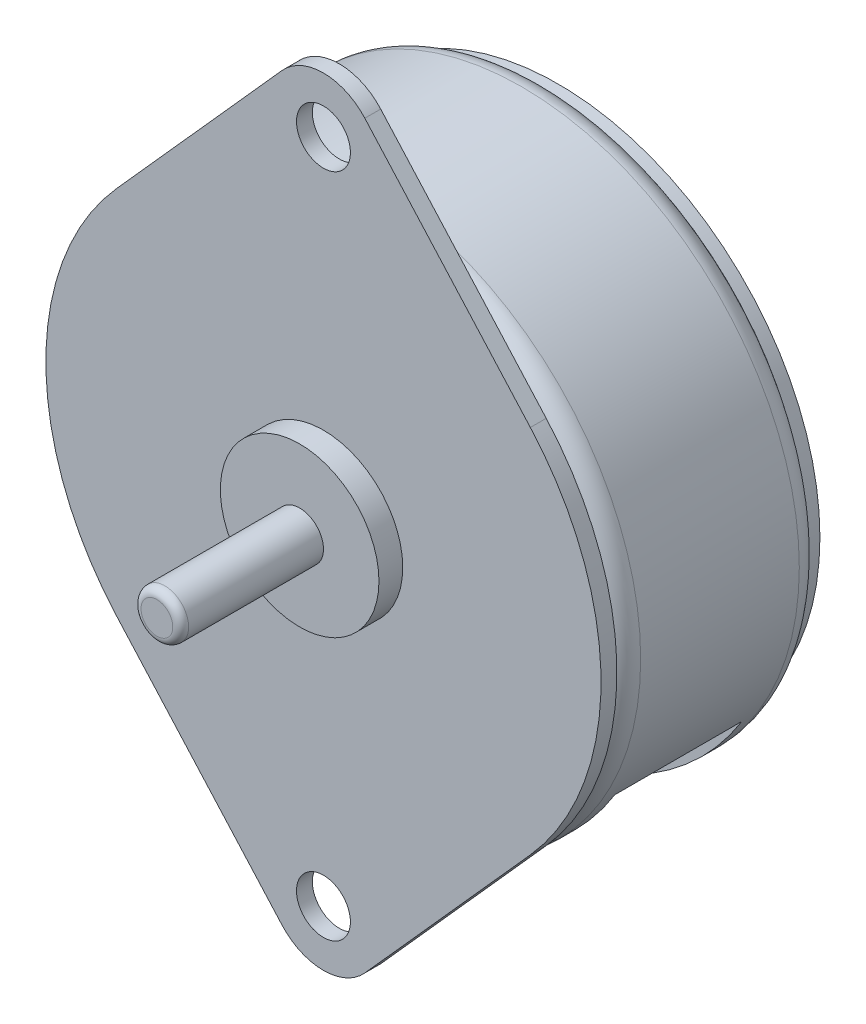
ISO-10303-21;
HEADER;
FILE_DESCRIPTION(('STEP AP214'),'2;1');
FILE_NAME('part.step','',(''),(''),'','','');
FILE_SCHEMA(('AUTOMOTIVE_DESIGN { 1 0 10303 214 1 1 1 1 }'));
ENDSEC;
DATA;
#1=APPLICATION_CONTEXT('core data for automotive mechanical design processes');
#2=APPLICATION_PROTOCOL_DEFINITION('international standard','automotive_design',2000,#1);
#3=PRODUCT_CONTEXT('',#1,'mechanical');
#4=PRODUCT('Part','Part','',(#3));
#5=PRODUCT_RELATED_PRODUCT_CATEGORY('part','',(#4));
#6=PRODUCT_DEFINITION_FORMATION('','',#4);
#7=PRODUCT_DEFINITION_CONTEXT('part definition',#1,'design');
#8=PRODUCT_DEFINITION('design','',#6,#7);
#9=PRODUCT_DEFINITION_SHAPE('','',#8);
#10=(LENGTH_UNIT() NAMED_UNIT(*) SI_UNIT(.MILLI.,.METRE.));
#11=(NAMED_UNIT(*) PLANE_ANGLE_UNIT() SI_UNIT($,.RADIAN.));
#12=(NAMED_UNIT(*) SI_UNIT($,.STERADIAN.) SOLID_ANGLE_UNIT());
#13=UNCERTAINTY_MEASURE_WITH_UNIT(LENGTH_MEASURE(1.E-05),#10,'distance_accuracy_value','');
#14=(GEOMETRIC_REPRESENTATION_CONTEXT(3) GLOBAL_UNCERTAINTY_ASSIGNED_CONTEXT((#13)) GLOBAL_UNIT_ASSIGNED_CONTEXT((#10,
#11,#12)) REPRESENTATION_CONTEXT('',''));
#15=CARTESIAN_POINT('',(0.,0.,0.));
#16=DIRECTION('',(0.,0.,1.));
#17=DIRECTION('',(1.,0.,0.));
#18=AXIS2_PLACEMENT_3D('',#15,#16,#17);
#19=CARTESIAN_POINT('',(0.,0.,-13.));
#20=DIRECTION('',(0.,0.,1.));
#21=DIRECTION('',(1.,0.,0.));
#22=AXIS2_PLACEMENT_3D('',#19,#20,#21);
#23=CYLINDRICAL_SURFACE('',#22,17.5);
#24=CARTESIAN_POINT('',(0.,0.,-1.5));
#25=DIRECTION('',(0.,0.,-1.));
#26=DIRECTION('',(-1.,0.,0.));
#27=AXIS2_PLACEMENT_3D('',#24,#25,#26);
#28=CIRCLE('',#27,17.5);
#29=CARTESIAN_POINT('',(-17.5,0.,-1.5));
#30=VERTEX_POINT('',#29);
#31=EDGE_CURVE('E192',#30,#30,#28,.T.);
#32=ORIENTED_EDGE('',*,*,#31,.T.);
#33=EDGE_LOOP('',(#32));
#34=FACE_BOUND('',#33,.T.);
#35=CARTESIAN_POINT('',(0.,0.,-11.5));
#36=DIRECTION('',(0.,0.,-1.));
#37=DIRECTION('',(-1.,0.,0.));
#38=AXIS2_PLACEMENT_3D('',#35,#36,#37);
#39=CIRCLE('',#38,17.5);
#40=CARTESIAN_POINT('',(-17.5,0.,-11.5));
#41=VERTEX_POINT('',#40);
#42=EDGE_CURVE('E195',#41,#41,#39,.F.);
#43=ORIENTED_EDGE('',*,*,#42,.T.);
#44=EDGE_LOOP('',(#43));
#45=FACE_BOUND('',#44,.T.);
#46=DIRECTION('',(0.,0.,1.));
#47=VECTOR('',#46,1.);
#48=CARTESIAN_POINT('',(9.21835667841054,-14.875210927903,-13.));
#49=LINE('',#48,#47);
#50=CARTESIAN_POINT('',(9.21835667841054,-14.875210927903,-2.5));
#51=VERTEX_POINT('',#50);
#52=CARTESIAN_POINT('',(9.21835667841054,-14.875210927903,-10.5));
#53=VERTEX_POINT('',#52);
#54=EDGE_CURVE('E11',#51,#53,#49,.F.);
#55=ORIENTED_EDGE('',*,*,#54,.F.);
#56=CARTESIAN_POINT('',(0.,0.,-2.5));
#57=DIRECTION('',(0.,0.,-1.));
#58=DIRECTION('',(-1.,0.,0.));
#59=AXIS2_PLACEMENT_3D('',#56,#57,#58);
#60=CIRCLE('',#59,17.5);
#61=CARTESIAN_POINT('',(14.8752109279029,-9.21835667841059,-2.5));
#62=VERTEX_POINT('',#61);
#63=EDGE_CURVE('E55',#62,#51,#60,.T.);
#64=ORIENTED_EDGE('',*,*,#63,.F.);
#65=DIRECTION('',(0.,0.,1.));
#66=VECTOR('',#65,1.);
#67=CARTESIAN_POINT('',(14.8752109279029,-9.21835667841059,-13.));
#68=LINE('',#67,#66);
#69=CARTESIAN_POINT('',(14.8752109279029,-9.21835667841059,-10.5));
#70=VERTEX_POINT('',#69);
#71=EDGE_CURVE('E283',#70,#62,#68,.T.);
#72=ORIENTED_EDGE('',*,*,#71,.F.);
#73=CARTESIAN_POINT('',(0.,0.,-10.5));
#74=DIRECTION('',(0.,0.,1.));
#75=DIRECTION('',(1.,0.,0.));
#76=AXIS2_PLACEMENT_3D('',#73,#74,#75);
#77=CIRCLE('',#76,17.5);
#78=EDGE_CURVE('E48',#53,#70,#77,.T.);
#79=ORIENTED_EDGE('',*,*,#78,.F.);
#80=EDGE_LOOP('',(#55,#64,#72,#79));
#81=FACE_BOUND('',#80,.T.);
#82=ADVANCED_FACE('F40',(#34,#45,#81),#23,.T.);
#83=CARTESIAN_POINT('',(0.,0.,-14.3));
#84=DIRECTION('',(0.,0.,-1.));
#85=DIRECTION('',(-1.,0.,0.));
#86=AXIS2_PLACEMENT_3D('',#83,#84,#85);
#87=PLANE('',#86);
#88=CARTESIAN_POINT('',(0.,0.,-14.3));
#89=DIRECTION('',(0.,0.,-1.));
#90=DIRECTION('',(-1.,0.,0.));
#91=AXIS2_PLACEMENT_3D('',#88,#89,#90);
#92=CIRCLE('',#91,3.);
#93=CARTESIAN_POINT('',(-3.,0.,-14.3));
#94=VERTEX_POINT('',#93);
#95=EDGE_CURVE('E169',#94,#94,#92,.T.);
#96=ORIENTED_EDGE('',*,*,#95,.T.);
#97=EDGE_LOOP('',(#96));
#98=FACE_BOUND('',#97,.T.);
#99=CARTESIAN_POINT('',(0.,0.,-14.3));
#100=DIRECTION('',(0.,0.,-1.));
#101=DIRECTION('',(-1.,0.,0.));
#102=AXIS2_PLACEMENT_3D('',#99,#100,#101);
#103=CIRCLE('',#102,1.5);
#104=CARTESIAN_POINT('',(-1.5,0.,-14.3));
#105=VERTEX_POINT('',#104);
#106=EDGE_CURVE('E163',#105,#105,#103,.T.);
#107=ORIENTED_EDGE('',*,*,#106,.F.);
#108=EDGE_LOOP('',(#107));
#109=FACE_BOUND('',#108,.T.);
#110=ADVANCED_FACE('F290',(#98,#109),#87,.T.);
#111=CARTESIAN_POINT('',(0.,0.,-13.8));
#112=DIRECTION('',(0.,0.,-1.));
#113=DIRECTION('',(-1.,0.,0.));
#114=AXIS2_PLACEMENT_3D('',#111,#112,#113);
#115=PLANE('',#114);
#116=CARTESIAN_POINT('',(0.,0.,-13.8));
#117=DIRECTION('',(0.,0.,-1.));
#118=DIRECTION('',(-1.,0.,0.));
#119=AXIS2_PLACEMENT_3D('',#116,#117,#118);
#120=CIRCLE('',#119,16.5);
#121=CARTESIAN_POINT('',(-16.5,0.,-13.8));
#122=VERTEX_POINT('',#121);
#123=EDGE_CURVE('E184',#122,#122,#120,.T.);
#124=ORIENTED_EDGE('',*,*,#123,.T.);
#125=EDGE_LOOP('',(#124));
#126=FACE_BOUND('',#125,.T.);
#127=CARTESIAN_POINT('',(0.,0.,-13.8));
#128=DIRECTION('',(0.,0.,-1.));
#129=DIRECTION('',(-1.,0.,0.));
#130=AXIS2_PLACEMENT_3D('',#127,#128,#129);
#131=CIRCLE('',#130,3.);
#132=CARTESIAN_POINT('',(-3.,0.,-13.8));
#133=VERTEX_POINT('',#132);
#134=EDGE_CURVE('E168',#133,#133,#131,.T.);
#135=ORIENTED_EDGE('',*,*,#134,.F.);
#136=EDGE_LOOP('',(#135));
#137=FACE_BOUND('',#136,.T.);
#138=ADVANCED_FACE('F296',(#126,#137),#115,.T.);
#139=CARTESIAN_POINT('',(0.,0.,2.5));
#140=DIRECTION('',(0.,0.,1.));
#141=DIRECTION('',(1.,0.,0.));
#142=AXIS2_PLACEMENT_3D('',#139,#140,#141);
#143=PLANE('',#142);
#144=CARTESIAN_POINT('',(0.,0.,2.5));
#145=DIRECTION('',(0.,0.,1.));
#146=DIRECTION('',(1.,0.,0.));
#147=AXIS2_PLACEMENT_3D('',#144,#145,#146);
#148=CIRCLE('',#147,5.);
#149=CARTESIAN_POINT('',(5.,0.,2.5));
#150=VERTEX_POINT('',#149);
#151=EDGE_CURVE('E178',#150,#150,#148,.T.);
#152=ORIENTED_EDGE('',*,*,#151,.T.);
#153=EDGE_LOOP('',(#152));
#154=FACE_BOUND('',#153,.T.);
#155=CARTESIAN_POINT('',(0.,0.,2.5));
#156=DIRECTION('',(0.,0.,1.));
#157=DIRECTION('',(1.,0.,0.));
#158=AXIS2_PLACEMENT_3D('',#155,#156,#157);
#159=CIRCLE('',#158,1.5);
#160=CARTESIAN_POINT('',(1.5,0.,2.5));
#161=VERTEX_POINT('',#160);
#162=EDGE_CURVE('E172',#161,#161,#159,.T.);
#163=ORIENTED_EDGE('',*,*,#162,.F.);
#164=EDGE_LOOP('',(#163));
#165=FACE_BOUND('',#164,.T.);
#166=ADVANCED_FACE('F325',(#154,#165),#143,.T.);
#167=CARTESIAN_POINT('',(0.,0.,1.));
#168=DIRECTION('',(0.,0.,1.));
#169=DIRECTION('',(1.,0.,0.));
#170=AXIS2_PLACEMENT_3D('',#167,#168,#169);
#171=PLANE('',#170);
#172=CARTESIAN_POINT('',(0.,-21.,1.));
#173=DIRECTION('',(0.,0.,1.));
#174=DIRECTION('',(1.,0.,0.));
#175=AXIS2_PLACEMENT_3D('',#172,#173,#174);
#176=CIRCLE('',#175,1.7);
#177=CARTESIAN_POINT('',(1.7,-21.,1.));
#178=VERTEX_POINT('',#177);
#179=EDGE_CURVE('E199',#178,#178,#176,.T.);
#180=ORIENTED_EDGE('',*,*,#179,.F.);
#181=EDGE_LOOP('',(#180));
#182=FACE_BOUND('',#181,.T.);
#183=CARTESIAN_POINT('',(0.,0.,1.));
#184=DIRECTION('',(0.,0.,1.));
#185=DIRECTION('',(1.,0.,0.));
#186=AXIS2_PLACEMENT_3D('',#183,#184,#185);
#187=CIRCLE('',#186,17.5);
#188=CARTESIAN_POINT('',(-13.0437298687488,11.6666666666667,1.));
#189=VERTEX_POINT('',#188);
#190=CARTESIAN_POINT('',(-13.0437298687488,-11.6666666666667,1.));
#191=VERTEX_POINT('',#190);
#192=EDGE_CURVE('E211',#189,#191,#187,.T.);
#193=ORIENTED_EDGE('',*,*,#192,.T.);
#194=DIRECTION('',(0.666666666666667,-0.74535599249993,0.));
#195=VECTOR('',#194,1.);
#196=CARTESIAN_POINT('',(-13.0437298687488,-11.6666666666667,1.));
#197=LINE('',#196,#195);
#198=CARTESIAN_POINT('',(-2.60874597374975,-23.3333333333333,1.));
#199=VERTEX_POINT('',#198);
#200=EDGE_CURVE('E214',#191,#199,#197,.T.);
#201=ORIENTED_EDGE('',*,*,#200,.T.);
#202=CARTESIAN_POINT('',(0.,-21.,1.));
#203=DIRECTION('',(0.,0.,1.));
#204=DIRECTION('',(-1.,0.,0.));
#205=AXIS2_PLACEMENT_3D('',#202,#203,#204);
#206=CIRCLE('',#205,3.5);
#207=CARTESIAN_POINT('',(2.60874597374975,-23.3333333333333,1.));
#208=VERTEX_POINT('',#207);
#209=EDGE_CURVE('E217',#199,#208,#206,.T.);
#210=ORIENTED_EDGE('',*,*,#209,.T.);
#211=DIRECTION('',(0.666666666666667,0.74535599249993,0.));
#212=VECTOR('',#211,1.);
#213=CARTESIAN_POINT('',(2.60874597374975,-23.3333333333333,1.));
#214=LINE('',#213,#212);
#215=CARTESIAN_POINT('',(13.0437298687488,-11.6666666666667,1.));
#216=VERTEX_POINT('',#215);
#217=EDGE_CURVE('E219',#208,#216,#214,.T.);
#218=ORIENTED_EDGE('',*,*,#217,.T.);
#219=CARTESIAN_POINT('',(0.,0.,1.));
#220=DIRECTION('',(0.,0.,1.));
#221=DIRECTION('',(1.,0.,0.));
#222=AXIS2_PLACEMENT_3D('',#219,#220,#221);
#223=CIRCLE('',#222,17.5);
#224=CARTESIAN_POINT('',(13.0437298687488,11.6666666666667,1.));
#225=VERTEX_POINT('',#224);
#226=EDGE_CURVE('E221',#216,#225,#223,.T.);
#227=ORIENTED_EDGE('',*,*,#226,.T.);
#228=DIRECTION('',(-0.666666666666667,0.74535599249993,0.));
#229=VECTOR('',#228,1.);
#230=CARTESIAN_POINT('',(2.60874597374975,23.3333333333333,1.));
#231=LINE('',#230,#229);
#232=CARTESIAN_POINT('',(2.60874597374975,23.3333333333333,1.));
#233=VERTEX_POINT('',#232);
#234=EDGE_CURVE('E223',#225,#233,#231,.T.);
#235=ORIENTED_EDGE('',*,*,#234,.T.);
#236=CARTESIAN_POINT('',(0.,21.,1.));
#237=DIRECTION('',(0.,0.,1.));
#238=DIRECTION('',(-1.,0.,0.));
#239=AXIS2_PLACEMENT_3D('',#236,#237,#238);
#240=CIRCLE('',#239,3.5);
#241=CARTESIAN_POINT('',(-2.60874597374975,23.3333333333333,1.));
#242=VERTEX_POINT('',#241);
#243=EDGE_CURVE('E225',#233,#242,#240,.T.);
#244=ORIENTED_EDGE('',*,*,#243,.T.);
#245=DIRECTION('',(-0.666666666666667,-0.74535599249993,0.));
#246=VECTOR('',#245,1.);
#247=CARTESIAN_POINT('',(-13.0437298687488,11.6666666666667,1.));
#248=LINE('',#247,#246);
#249=EDGE_CURVE('E227',#242,#189,#248,.T.);
#250=ORIENTED_EDGE('',*,*,#249,.T.);
#251=EDGE_LOOP('',(#193,#201,#210,#218,#227,#235,#244,#250));
#252=FACE_BOUND('',#251,.T.);
#253=CARTESIAN_POINT('',(0.,21.,1.));
#254=DIRECTION('',(0.,0.,1.));
#255=DIRECTION('',(1.,0.,0.));
#256=AXIS2_PLACEMENT_3D('',#253,#254,#255);
#257=CIRCLE('',#256,1.7);
#258=CARTESIAN_POINT('',(1.7,21.,1.));
#259=VERTEX_POINT('',#258);
#260=EDGE_CURVE('E205',#259,#259,#257,.T.);
#261=ORIENTED_EDGE('',*,*,#260,.F.);
#262=EDGE_LOOP('',(#261));
#263=FACE_BOUND('',#262,.T.);
#264=CARTESIAN_POINT('',(0.,0.,1.));
#265=DIRECTION('',(0.,0.,1.));
#266=DIRECTION('',(1.,0.,0.));
#267=AXIS2_PLACEMENT_3D('',#264,#265,#266);
#268=CIRCLE('',#267,5.);
#269=CARTESIAN_POINT('',(5.,0.,1.));
#270=VERTEX_POINT('',#269);
#271=EDGE_CURVE('E177',#270,#270,#268,.T.);
#272=ORIENTED_EDGE('',*,*,#271,.F.);
#273=EDGE_LOOP('',(#272));
#274=FACE_BOUND('',#273,.T.);
#275=ADVANCED_FACE('F321',(#182,#252,#263,#274),#171,.T.);
#276=CARTESIAN_POINT('',(0.,0.,0.));
#277=DIRECTION('',(0.,0.,1.));
#278=DIRECTION('',(1.,0.,0.));
#279=AXIS2_PLACEMENT_3D('',#276,#277,#278);
#280=PLANE('',#279);
#281=CARTESIAN_POINT('',(0.,-21.,0.));
#282=DIRECTION('',(0.,0.,1.));
#283=DIRECTION('',(1.,0.,0.));
#284=AXIS2_PLACEMENT_3D('',#281,#282,#283);
#285=CIRCLE('',#284,1.7);
#286=CARTESIAN_POINT('',(1.7,-21.,0.));
#287=VERTEX_POINT('',#286);
#288=EDGE_CURVE('E198',#287,#287,#285,.T.);
#289=ORIENTED_EDGE('',*,*,#288,.T.);
#290=EDGE_LOOP('',(#289));
#291=FACE_BOUND('',#290,.T.);
#292=CARTESIAN_POINT('',(0.,0.,0.));
#293=DIRECTION('',(0.,0.,1.));
#294=DIRECTION('',(1.,0.,0.));
#295=AXIS2_PLACEMENT_3D('',#292,#293,#294);
#296=CIRCLE('',#295,17.5);
#297=CARTESIAN_POINT('',(-13.0437298687488,11.6666666666667,0.));
#298=VERTEX_POINT('',#297);
#299=CARTESIAN_POINT('',(-13.0437298687488,-11.6666666666667,0.));
#300=VERTEX_POINT('',#299);
#301=EDGE_CURVE('E208',#298,#300,#296,.T.);
#302=ORIENTED_EDGE('',*,*,#301,.F.);
#303=DIRECTION('',(-0.666666666666667,-0.74535599249993,0.));
#304=VECTOR('',#303,1.);
#305=CARTESIAN_POINT('',(-13.0437298687488,11.6666666666667,0.));
#306=LINE('',#305,#304);
#307=CARTESIAN_POINT('',(-2.60874597374975,23.3333333333333,0.));
#308=VERTEX_POINT('',#307);
#309=EDGE_CURVE('E215',#308,#298,#306,.T.);
#310=ORIENTED_EDGE('',*,*,#309,.F.);
#311=CARTESIAN_POINT('',(0.,21.,0.));
#312=DIRECTION('',(0.,0.,1.));
#313=DIRECTION('',(-1.,0.,0.));
#314=AXIS2_PLACEMENT_3D('',#311,#312,#313);
#315=CIRCLE('',#314,3.5);
#316=CARTESIAN_POINT('',(2.60874597374975,23.3333333333333,0.));
#317=VERTEX_POINT('',#316);
#318=EDGE_CURVE('E242',#317,#308,#315,.T.);
#319=ORIENTED_EDGE('',*,*,#318,.F.);
#320=DIRECTION('',(-0.666666666666667,0.74535599249993,0.));
#321=VECTOR('',#320,1.);
#322=CARTESIAN_POINT('',(2.60874597374975,23.3333333333333,0.));
#323=LINE('',#322,#321);
#324=CARTESIAN_POINT('',(13.0437298687488,11.6666666666667,0.));
#325=VERTEX_POINT('',#324);
#326=EDGE_CURVE('E240',#325,#317,#323,.T.);
#327=ORIENTED_EDGE('',*,*,#326,.F.);
#328=CARTESIAN_POINT('',(0.,0.,0.));
#329=DIRECTION('',(0.,0.,1.));
#330=DIRECTION('',(1.,0.,0.));
#331=AXIS2_PLACEMENT_3D('',#328,#329,#330);
#332=CIRCLE('',#331,17.5);
#333=CARTESIAN_POINT('',(13.0437298687488,-11.6666666666667,0.));
#334=VERTEX_POINT('',#333);
#335=EDGE_CURVE('E238',#334,#325,#332,.T.);
#336=ORIENTED_EDGE('',*,*,#335,.F.);
#337=DIRECTION('',(0.666666666666667,0.74535599249993,0.));
#338=VECTOR('',#337,1.);
#339=CARTESIAN_POINT('',(2.60874597374975,-23.3333333333333,0.));
#340=LINE('',#339,#338);
#341=CARTESIAN_POINT('',(2.60874597374975,-23.3333333333333,0.));
#342=VERTEX_POINT('',#341);
#343=EDGE_CURVE('E236',#342,#334,#340,.T.);
#344=ORIENTED_EDGE('',*,*,#343,.F.);
#345=CARTESIAN_POINT('',(0.,-21.,0.));
#346=DIRECTION('',(0.,0.,1.));
#347=DIRECTION('',(-1.,0.,0.));
#348=AXIS2_PLACEMENT_3D('',#345,#346,#347);
#349=CIRCLE('',#348,3.5);
#350=CARTESIAN_POINT('',(-2.60874597374975,-23.3333333333333,0.));
#351=VERTEX_POINT('',#350);
#352=EDGE_CURVE('E234',#351,#342,#349,.T.);
#353=ORIENTED_EDGE('',*,*,#352,.F.);
#354=DIRECTION('',(0.666666666666667,-0.74535599249993,0.));
#355=VECTOR('',#354,1.);
#356=CARTESIAN_POINT('',(-13.0437298687488,-11.6666666666667,0.));
#357=LINE('',#356,#355);
#358=EDGE_CURVE('E232',#300,#351,#357,.T.);
#359=ORIENTED_EDGE('',*,*,#358,.F.);
#360=EDGE_LOOP('',(#302,#310,#319,#327,#336,#344,#353,#359));
#361=FACE_BOUND('',#360,.T.);
#362=CARTESIAN_POINT('',(0.,21.,0.));
#363=DIRECTION('',(0.,0.,1.));
#364=DIRECTION('',(1.,0.,0.));
#365=AXIS2_PLACEMENT_3D('',#362,#363,#364);
#366=CIRCLE('',#365,1.7);
#367=CARTESIAN_POINT('',(1.7,21.,0.));
#368=VERTEX_POINT('',#367);
#369=EDGE_CURVE('E202',#368,#368,#366,.T.);
#370=ORIENTED_EDGE('',*,*,#369,.T.);
#371=EDGE_LOOP('',(#370));
#372=FACE_BOUND('',#371,.T.);
#373=CARTESIAN_POINT('',(0.,0.,0.));
#374=DIRECTION('',(0.,0.,-1.));
#375=DIRECTION('',(-1.,0.,0.));
#376=AXIS2_PLACEMENT_3D('',#373,#374,#375);
#377=CIRCLE('',#376,16.);
#378=CARTESIAN_POINT('',(-16.,0.,0.));
#379=VERTEX_POINT('',#378);
#380=EDGE_CURVE('E268',#379,#379,#377,.T.);
#381=ORIENTED_EDGE('',*,*,#380,.F.);
#382=EDGE_LOOP('',(#381));
#383=FACE_BOUND('',#382,.T.);
#384=ADVANCED_FACE('F324',(#291,#361,#372,#383),#280,.F.);
#385=CARTESIAN_POINT('',(0.,0.,1.));
#386=DIRECTION('',(0.,0.,-1.));
#387=DIRECTION('',(-1.,0.,0.));
#388=AXIS2_PLACEMENT_3D('',#385,#386,#387);
#389=CYLINDRICAL_SURFACE('',#388,17.5);
#390=ORIENTED_EDGE('',*,*,#301,.T.);
#391=DIRECTION('',(0.,0.,-1.));
#392=VECTOR('',#391,1.);
#393=CARTESIAN_POINT('',(-13.0437298687488,-11.6666666666667,1.));
#394=LINE('',#393,#392);
#395=EDGE_CURVE('E265',#191,#300,#394,.T.);
#396=ORIENTED_EDGE('',*,*,#395,.F.);
#397=ORIENTED_EDGE('',*,*,#192,.F.);
#398=DIRECTION('',(0.,0.,-1.));
#399=VECTOR('',#398,1.);
#400=CARTESIAN_POINT('',(-13.0437298687488,11.6666666666667,1.));
#401=LINE('',#400,#399);
#402=EDGE_CURVE('E229',#189,#298,#401,.T.);
#403=ORIENTED_EDGE('',*,*,#402,.T.);
#404=EDGE_LOOP('',(#390,#396,#397,#403));
#405=FACE_BOUND('',#404,.T.);
#406=ADVANCED_FACE('F329',(#405),#389,.T.);
#407=CARTESIAN_POINT('',(-13.0437298687488,-11.6666666666667,1.));
#408=DIRECTION('',(0.74535599249993,0.666666666666667,0.));
#409=DIRECTION('',(-0.666666666666667,0.74535599249993,0.));
#410=AXIS2_PLACEMENT_3D('',#407,#408,#409);
#411=PLANE('',#410);
#412=ORIENTED_EDGE('',*,*,#358,.T.);
#413=DIRECTION('',(0.,0.,-1.));
#414=VECTOR('',#413,1.);
#415=CARTESIAN_POINT('',(-2.60874597374975,-23.3333333333333,1.));
#416=LINE('',#415,#414);
#417=EDGE_CURVE('E262',#199,#351,#416,.T.);
#418=ORIENTED_EDGE('',*,*,#417,.F.);
#419=ORIENTED_EDGE('',*,*,#200,.F.);
#420=ORIENTED_EDGE('',*,*,#395,.T.);
#421=EDGE_LOOP('',(#412,#418,#419,#420));
#422=FACE_BOUND('',#421,.T.);
#423=ADVANCED_FACE('F353',(#422),#411,.F.);
#424=CARTESIAN_POINT('',(0.,-21.,1.));
#425=DIRECTION('',(0.,0.,-1.));
#426=DIRECTION('',(-1.,0.,0.));
#427=AXIS2_PLACEMENT_3D('',#424,#425,#426);
#428=CYLINDRICAL_SURFACE('',#427,3.5);
#429=ORIENTED_EDGE('',*,*,#352,.T.);
#430=DIRECTION('',(0.,0.,-1.));
#431=VECTOR('',#430,1.);
#432=CARTESIAN_POINT('',(2.60874597374975,-23.3333333333333,1.));
#433=LINE('',#432,#431);
#434=EDGE_CURVE('E259',#208,#342,#433,.T.);
#435=ORIENTED_EDGE('',*,*,#434,.F.);
#436=ORIENTED_EDGE('',*,*,#209,.F.);
#437=ORIENTED_EDGE('',*,*,#417,.T.);
#438=EDGE_LOOP('',(#429,#435,#436,#437));
#439=FACE_BOUND('',#438,.T.);
#440=ADVANCED_FACE('F349',(#439),#428,.T.);
#441=CARTESIAN_POINT('',(2.60874597374975,-23.3333333333333,1.));
#442=DIRECTION('',(-0.74535599249993,0.666666666666667,0.));
#443=DIRECTION('',(-0.666666666666667,-0.74535599249993,0.));
#444=AXIS2_PLACEMENT_3D('',#441,#442,#443);
#445=PLANE('',#444);
#446=ORIENTED_EDGE('',*,*,#343,.T.);
#447=DIRECTION('',(0.,0.,-1.));
#448=VECTOR('',#447,1.);
#449=CARTESIAN_POINT('',(13.0437298687488,-11.6666666666667,1.));
#450=LINE('',#449,#448);
#451=EDGE_CURVE('E256',#216,#334,#450,.T.);
#452=ORIENTED_EDGE('',*,*,#451,.F.);
#453=ORIENTED_EDGE('',*,*,#217,.F.);
#454=ORIENTED_EDGE('',*,*,#434,.T.);
#455=EDGE_LOOP('',(#446,#452,#453,#454));
#456=FACE_BOUND('',#455,.T.);
#457=ADVANCED_FACE('F345',(#456),#445,.F.);
#458=CARTESIAN_POINT('',(0.,0.,1.));
#459=DIRECTION('',(0.,0.,-1.));
#460=DIRECTION('',(-1.,0.,0.));
#461=AXIS2_PLACEMENT_3D('',#458,#459,#460);
#462=CYLINDRICAL_SURFACE('',#461,17.5);
#463=ORIENTED_EDGE('',*,*,#335,.T.);
#464=DIRECTION('',(0.,0.,-1.));
#465=VECTOR('',#464,1.);
#466=CARTESIAN_POINT('',(13.0437298687488,11.6666666666667,1.));
#467=LINE('',#466,#465);
#468=EDGE_CURVE('E253',#225,#325,#467,.T.);
#469=ORIENTED_EDGE('',*,*,#468,.F.);
#470=ORIENTED_EDGE('',*,*,#226,.F.);
#471=ORIENTED_EDGE('',*,*,#451,.T.);
#472=EDGE_LOOP('',(#463,#469,#470,#471));
#473=FACE_BOUND('',#472,.T.);
#474=ADVANCED_FACE('F341',(#473),#462,.T.);
#475=CARTESIAN_POINT('',(2.60874597374975,23.3333333333333,1.));
#476=DIRECTION('',(-0.74535599249993,-0.666666666666667,0.));
#477=DIRECTION('',(0.666666666666667,-0.74535599249993,0.));
#478=AXIS2_PLACEMENT_3D('',#475,#476,#477);
#479=PLANE('',#478);
#480=ORIENTED_EDGE('',*,*,#326,.T.);
#481=DIRECTION('',(0.,0.,-1.));
#482=VECTOR('',#481,1.);
#483=CARTESIAN_POINT('',(2.60874597374975,23.3333333333333,1.));
#484=LINE('',#483,#482);
#485=EDGE_CURVE('E250',#233,#317,#484,.T.);
#486=ORIENTED_EDGE('',*,*,#485,.F.);
#487=ORIENTED_EDGE('',*,*,#234,.F.);
#488=ORIENTED_EDGE('',*,*,#468,.T.);
#489=EDGE_LOOP('',(#480,#486,#487,#488));
#490=FACE_BOUND('',#489,.T.);
#491=ADVANCED_FACE('F337',(#490),#479,.F.);
#492=CARTESIAN_POINT('',(0.,21.,1.));
#493=DIRECTION('',(0.,0.,-1.));
#494=DIRECTION('',(-1.,0.,0.));
#495=AXIS2_PLACEMENT_3D('',#492,#493,#494);
#496=CYLINDRICAL_SURFACE('',#495,3.5);
#497=ORIENTED_EDGE('',*,*,#318,.T.);
#498=DIRECTION('',(0.,0.,-1.));
#499=VECTOR('',#498,1.);
#500=CARTESIAN_POINT('',(-2.60874597374975,23.3333333333333,1.));
#501=LINE('',#500,#499);
#502=EDGE_CURVE('E247',#242,#308,#501,.T.);
#503=ORIENTED_EDGE('',*,*,#502,.F.);
#504=ORIENTED_EDGE('',*,*,#243,.F.);
#505=ORIENTED_EDGE('',*,*,#485,.T.);
#506=EDGE_LOOP('',(#497,#503,#504,#505));
#507=FACE_BOUND('',#506,.T.);
#508=ADVANCED_FACE('F333',(#507),#496,.T.);
#509=CARTESIAN_POINT('',(-13.0437298687488,11.6666666666667,1.));
#510=DIRECTION('',(0.74535599249993,-0.666666666666667,0.));
#511=DIRECTION('',(0.666666666666667,0.74535599249993,0.));
#512=AXIS2_PLACEMENT_3D('',#509,#510,#511);
#513=PLANE('',#512);
#514=ORIENTED_EDGE('',*,*,#309,.T.);
#515=ORIENTED_EDGE('',*,*,#402,.F.);
#516=ORIENTED_EDGE('',*,*,#249,.F.);
#517=ORIENTED_EDGE('',*,*,#502,.T.);
#518=EDGE_LOOP('',(#514,#515,#516,#517));
#519=FACE_BOUND('',#518,.T.);
#520=ADVANCED_FACE('F319',(#519),#513,.F.);
#521=CARTESIAN_POINT('',(0.,21.,1.));
#522=DIRECTION('',(0.,0.,-1.));
#523=DIRECTION('',(-1.,0.,0.));
#524=AXIS2_PLACEMENT_3D('',#521,#522,#523);
#525=CYLINDRICAL_SURFACE('',#524,1.7);
#526=ORIENTED_EDGE('',*,*,#260,.T.);
#527=EDGE_LOOP('',(#526));
#528=FACE_BOUND('',#527,.T.);
#529=ORIENTED_EDGE('',*,*,#369,.F.);
#530=EDGE_LOOP('',(#529));
#531=FACE_BOUND('',#530,.T.);
#532=ADVANCED_FACE('F315',(#528,#531),#525,.F.);
#533=CARTESIAN_POINT('',(0.,-21.,1.));
#534=DIRECTION('',(0.,0.,-1.));
#535=DIRECTION('',(-1.,0.,0.));
#536=AXIS2_PLACEMENT_3D('',#533,#534,#535);
#537=CYLINDRICAL_SURFACE('',#536,1.7);
#538=ORIENTED_EDGE('',*,*,#179,.T.);
#539=EDGE_LOOP('',(#538));
#540=FACE_BOUND('',#539,.T.);
#541=ORIENTED_EDGE('',*,*,#288,.F.);
#542=EDGE_LOOP('',(#541));
#543=FACE_BOUND('',#542,.T.);
#544=ADVANCED_FACE('F308',(#540,#543),#537,.F.);
#545=CARTESIAN_POINT('',(0.,0.,-11.5));
#546=DIRECTION('',(0.,0.,-1.));
#547=DIRECTION('',(-1.,0.,0.));
#548=AXIS2_PLACEMENT_3D('',#545,#546,#547);
#549=TOROIDAL_SURFACE('',#548,16.,1.5);
#550=ORIENTED_EDGE('',*,*,#42,.F.);
#551=EDGE_LOOP('',(#550));
#552=FACE_BOUND('',#551,.T.);
#553=CARTESIAN_POINT('',(0.,0.,-13.));
#554=DIRECTION('',(0.,0.,-1.));
#555=DIRECTION('',(-1.,0.,0.));
#556=AXIS2_PLACEMENT_3D('',#553,#554,#555);
#557=CIRCLE('',#556,16.);
#558=CARTESIAN_POINT('',(-16.,0.,-13.));
#559=VERTEX_POINT('',#558);
#560=EDGE_CURVE('E187',#559,#559,#557,.T.);
#561=ORIENTED_EDGE('',*,*,#560,.F.);
#562=EDGE_LOOP('',(#561));
#563=FACE_BOUND('',#562,.T.);
#564=ADVANCED_FACE('F304',(#552,#563),#549,.T.);
#565=CARTESIAN_POINT('',(0.,0.,-1.5));
#566=DIRECTION('',(0.,0.,-1.));
#567=DIRECTION('',(-1.,0.,0.));
#568=AXIS2_PLACEMENT_3D('',#565,#566,#567);
#569=TOROIDAL_SURFACE('',#568,16.,1.5);
#570=ORIENTED_EDGE('',*,*,#380,.T.);
#571=EDGE_LOOP('',(#570));
#572=FACE_BOUND('',#571,.T.);
#573=ORIENTED_EDGE('',*,*,#31,.F.);
#574=EDGE_LOOP('',(#573));
#575=FACE_BOUND('',#574,.T.);
#576=ADVANCED_FACE('F307',(#572,#575),#569,.T.);
#577=CARTESIAN_POINT('',(0.,0.,-13.8));
#578=DIRECTION('',(0.,0.,1.));
#579=DIRECTION('',(1.,0.,0.));
#580=AXIS2_PLACEMENT_3D('',#577,#578,#579);
#581=CYLINDRICAL_SURFACE('',#580,16.5);
#582=ORIENTED_EDGE('',*,*,#123,.F.);
#583=EDGE_LOOP('',(#582));
#584=FACE_BOUND('',#583,.T.);
#585=CARTESIAN_POINT('',(0.,0.,-13.));
#586=DIRECTION('',(0.,0.,-1.));
#587=DIRECTION('',(-1.,0.,0.));
#588=AXIS2_PLACEMENT_3D('',#585,#586,#587);
#589=CIRCLE('',#588,16.5);
#590=CARTESIAN_POINT('',(-16.5,0.,-13.));
#591=VERTEX_POINT('',#590);
#592=EDGE_CURVE('E181',#591,#591,#589,.T.);
#593=ORIENTED_EDGE('',*,*,#592,.T.);
#594=EDGE_LOOP('',(#593));
#595=FACE_BOUND('',#594,.T.);
#596=ADVANCED_FACE('F302',(#584,#595),#581,.T.);
#597=CARTESIAN_POINT('',(0.,0.,-13.));
#598=DIRECTION('',(0.,0.,-1.));
#599=DIRECTION('',(-1.,0.,0.));
#600=AXIS2_PLACEMENT_3D('',#597,#598,#599);
#601=PLANE('',#600);
#602=ORIENTED_EDGE('',*,*,#560,.T.);
#603=EDGE_LOOP('',(#602));
#604=FACE_BOUND('',#603,.T.);
#605=ORIENTED_EDGE('',*,*,#592,.F.);
#606=EDGE_LOOP('',(#605));
#607=FACE_BOUND('',#606,.T.);
#608=ADVANCED_FACE('F395',(#604,#607),#601,.F.);
#609=CARTESIAN_POINT('',(0.,0.,2.5));
#610=DIRECTION('',(0.,0.,-1.));
#611=DIRECTION('',(-1.,0.,0.));
#612=AXIS2_PLACEMENT_3D('',#609,#610,#611);
#613=CYLINDRICAL_SURFACE('',#612,5.);
#614=ORIENTED_EDGE('',*,*,#151,.F.);
#615=EDGE_LOOP('',(#614));
#616=FACE_BOUND('',#615,.T.);
#617=ORIENTED_EDGE('',*,*,#271,.T.);
#618=EDGE_LOOP('',(#617));
#619=FACE_BOUND('',#618,.T.);
#620=ADVANCED_FACE('F381',(#616,#619),#613,.T.);
#621=CARTESIAN_POINT('',(0.,0.,11.5));
#622=DIRECTION('',(0.,0.,-1.));
#623=DIRECTION('',(-1.,0.,0.));
#624=AXIS2_PLACEMENT_3D('',#621,#622,#623);
#625=CYLINDRICAL_SURFACE('',#624,1.5);
#626=CARTESIAN_POINT('',(0.,0.,11.));
#627=DIRECTION('',(0.,0.,1.));
#628=DIRECTION('',(1.,0.,0.));
#629=AXIS2_PLACEMENT_3D('',#626,#627,#628);
#630=CIRCLE('',#629,1.5);
#631=CARTESIAN_POINT('',(1.5,0.,11.));
#632=VERTEX_POINT('',#631);
#633=EDGE_CURVE('E274',#632,#632,#630,.F.);
#634=ORIENTED_EDGE('',*,*,#633,.T.);
#635=EDGE_LOOP('',(#634));
#636=FACE_BOUND('',#635,.T.);
#637=ORIENTED_EDGE('',*,*,#162,.T.);
#638=EDGE_LOOP('',(#637));
#639=FACE_BOUND('',#638,.T.);
#640=ADVANCED_FACE('F372',(#636,#639),#625,.T.);
#641=CARTESIAN_POINT('',(0.,0.,11.5));
#642=DIRECTION('',(0.,0.,1.));
#643=DIRECTION('',(1.,0.,0.));
#644=AXIS2_PLACEMENT_3D('',#641,#642,#643);
#645=PLANE('',#644);
#646=CARTESIAN_POINT('',(0.,0.,11.5));
#647=DIRECTION('',(0.,0.,1.));
#648=DIRECTION('',(1.,0.,0.));
#649=AXIS2_PLACEMENT_3D('',#646,#647,#648);
#650=CIRCLE('',#649,1.);
#651=CARTESIAN_POINT('',(1.,0.,11.5));
#652=VERTEX_POINT('',#651);
#653=EDGE_CURVE('E271',#652,#652,#650,.T.);
#654=ORIENTED_EDGE('',*,*,#653,.T.);
#655=EDGE_LOOP('',(#654));
#656=FACE_BOUND('',#655,.T.);
#657=ADVANCED_FACE('F363',(#656),#645,.T.);
#658=CARTESIAN_POINT('',(0.,0.,11.));
#659=DIRECTION('',(0.,0.,1.));
#660=DIRECTION('',(1.,0.,0.));
#661=AXIS2_PLACEMENT_3D('',#658,#659,#660);
#662=TOROIDAL_SURFACE('',#661,1.,0.5);
#663=ORIENTED_EDGE('',*,*,#633,.F.);
#664=EDGE_LOOP('',(#663));
#665=FACE_BOUND('',#664,.T.);
#666=ORIENTED_EDGE('',*,*,#653,.F.);
#667=EDGE_LOOP('',(#666));
#668=FACE_BOUND('',#667,.T.);
#669=ADVANCED_FACE('F360',(#665,#668),#662,.T.);
#670=CARTESIAN_POINT('',(0.,0.,-14.3));
#671=DIRECTION('',(0.,0.,1.));
#672=DIRECTION('',(1.,0.,0.));
#673=AXIS2_PLACEMENT_3D('',#670,#671,#672);
#674=CYLINDRICAL_SURFACE('',#673,3.);
#675=ORIENTED_EDGE('',*,*,#95,.F.);
#676=EDGE_LOOP('',(#675));
#677=FACE_BOUND('',#676,.T.);
#678=ORIENTED_EDGE('',*,*,#134,.T.);
#679=EDGE_LOOP('',(#678));
#680=FACE_BOUND('',#679,.T.);
#681=ADVANCED_FACE('F362',(#677,#680),#674,.T.);
#682=CARTESIAN_POINT('',(0.,0.,-15.3));
#683=DIRECTION('',(0.,0.,1.));
#684=DIRECTION('',(1.,0.,0.));
#685=AXIS2_PLACEMENT_3D('',#682,#683,#684);
#686=CYLINDRICAL_SURFACE('',#685,1.5);
#687=CARTESIAN_POINT('',(0.,0.,-14.8));
#688=DIRECTION('',(0.,0.,-1.));
#689=DIRECTION('',(-1.,0.,0.));
#690=AXIS2_PLACEMENT_3D('',#687,#688,#689);
#691=CIRCLE('',#690,1.5);
#692=CARTESIAN_POINT('',(-1.5,0.,-14.8));
#693=VERTEX_POINT('',#692);
#694=EDGE_CURVE('E280',#693,#693,#691,.F.);
#695=ORIENTED_EDGE('',*,*,#694,.T.);
#696=EDGE_LOOP('',(#695));
#697=FACE_BOUND('',#696,.T.);
#698=ORIENTED_EDGE('',*,*,#106,.T.);
#699=EDGE_LOOP('',(#698));
#700=FACE_BOUND('',#699,.T.);
#701=ADVANCED_FACE('F369',(#697,#700),#686,.T.);
#702=CARTESIAN_POINT('',(0.,0.,-15.3));
#703=DIRECTION('',(0.,0.,-1.));
#704=DIRECTION('',(-1.,0.,0.));
#705=AXIS2_PLACEMENT_3D('',#702,#703,#704);
#706=PLANE('',#705);
#707=CARTESIAN_POINT('',(0.,0.,-15.3));
#708=DIRECTION('',(0.,0.,-1.));
#709=DIRECTION('',(-1.,0.,0.));
#710=AXIS2_PLACEMENT_3D('',#707,#708,#709);
#711=CIRCLE('',#710,1.);
#712=CARTESIAN_POINT('',(-1.,0.,-15.3));
#713=VERTEX_POINT('',#712);
#714=EDGE_CURVE('E277',#713,#713,#711,.T.);
#715=ORIENTED_EDGE('',*,*,#714,.T.);
#716=EDGE_LOOP('',(#715));
#717=FACE_BOUND('',#716,.T.);
#718=ADVANCED_FACE('F617',(#717),#706,.T.);
#719=CARTESIAN_POINT('',(0.,0.,-14.8));
#720=DIRECTION('',(0.,0.,-1.));
#721=DIRECTION('',(-1.,0.,0.));
#722=AXIS2_PLACEMENT_3D('',#719,#720,#721);
#723=TOROIDAL_SURFACE('',#722,1.,0.5);
#724=ORIENTED_EDGE('',*,*,#694,.F.);
#725=EDGE_LOOP('',(#724));
#726=FACE_BOUND('',#725,.T.);
#727=ORIENTED_EDGE('',*,*,#714,.F.);
#728=EDGE_LOOP('',(#727));
#729=FACE_BOUND('',#728,.T.);
#730=ADVANCED_FACE('F42',(#726,#729),#723,.T.);
#731=CARTESIAN_POINT('',(15.2027957955108,-9.54594154601842,-10.5));
#732=DIRECTION('',(0.,0.,1.));
#733=DIRECTION('',(1.,0.,0.));
#734=AXIS2_PLACEMENT_3D('',#731,#732,#733);
#735=PLANE('',#734);
#736=DIRECTION('',(-0.707106781186546,0.707106781186549,0.));
#737=VECTOR('',#736,1.);
#738=CARTESIAN_POINT('',(9.54594154601837,-15.2027957955108,-10.5));
#739=LINE('',#738,#737);
#740=CARTESIAN_POINT('',(8.12602402535711,-13.7828782748495,-10.5));
#741=VERTEX_POINT('',#740);
#742=EDGE_CURVE('E152',#53,#741,#739,.T.);
#743=ORIENTED_EDGE('',*,*,#742,.F.);
#744=ORIENTED_EDGE('',*,*,#78,.T.);
#745=DIRECTION('',(-0.707106781186546,0.707106781186549,0.));
#746=VECTOR('',#745,1.);
#747=CARTESIAN_POINT('',(15.2027957955108,-9.54594154601842,-10.5));
#748=LINE('',#747,#746);
#749=CARTESIAN_POINT('',(13.7828782748495,-8.12602402535716,-10.5));
#750=VERTEX_POINT('',#749);
#751=EDGE_CURVE('E127',#70,#750,#748,.T.);
#752=ORIENTED_EDGE('',*,*,#751,.T.);
#753=CARTESIAN_POINT('',(0.,0.,-10.5));
#754=DIRECTION('',(0.,0.,1.));
#755=DIRECTION('',(1.,0.,0.));
#756=AXIS2_PLACEMENT_3D('',#753,#754,#755);
#757=CIRCLE('',#756,16.);
#758=EDGE_CURVE('E132',#741,#750,#757,.T.);
#759=ORIENTED_EDGE('',*,*,#758,.F.);
#760=EDGE_LOOP('',(#743,#744,#752,#759));
#761=FACE_BOUND('',#760,.T.);
#762=ADVANCED_FACE('F130',(#761),#735,.T.);
#763=CARTESIAN_POINT('',(9.54594154601837,-15.2027957955108,-2.5));
#764=DIRECTION('',(0.707106781186549,0.707106781186546,0.));
#765=DIRECTION('',(-0.707106781186546,0.707106781186549,0.));
#766=AXIS2_PLACEMENT_3D('',#763,#764,#765);
#767=PLANE('',#766);
#768=DIRECTION('',(-0.707106781186546,0.707106781186549,0.));
#769=VECTOR('',#768,1.);
#770=CARTESIAN_POINT('',(9.54594154601837,-15.2027957955108,-2.5));
#771=LINE('',#770,#769);
#772=CARTESIAN_POINT('',(8.12602402535711,-13.7828782748495,-2.5));
#773=VERTEX_POINT('',#772);
#774=EDGE_CURVE('E136',#51,#773,#771,.T.);
#775=ORIENTED_EDGE('',*,*,#774,.F.);
#776=ORIENTED_EDGE('',*,*,#54,.T.);
#777=ORIENTED_EDGE('',*,*,#742,.T.);
#778=DIRECTION('',(0.,0.,1.));
#779=VECTOR('',#778,1.);
#780=CARTESIAN_POINT('',(8.12602402535711,-13.7828782748495,-13.));
#781=LINE('',#780,#779);
#782=EDGE_CURVE('E150',#773,#741,#781,.F.);
#783=ORIENTED_EDGE('',*,*,#782,.F.);
#784=EDGE_LOOP('',(#775,#776,#777,#783));
#785=FACE_BOUND('',#784,.T.);
#786=ADVANCED_FACE('F288',(#785),#767,.T.);
#787=CARTESIAN_POINT('',(15.2027957955108,-9.54594154601842,-2.5));
#788=DIRECTION('',(0.,0.,-1.));
#789=DIRECTION('',(-1.,0.,0.));
#790=AXIS2_PLACEMENT_3D('',#787,#788,#789);
#791=PLANE('',#790);
#792=DIRECTION('',(-0.707106781186546,0.707106781186549,0.));
#793=VECTOR('',#792,1.);
#794=CARTESIAN_POINT('',(15.2027957955108,-9.54594154601842,-2.5));
#795=LINE('',#794,#793);
#796=CARTESIAN_POINT('',(13.7828782748495,-8.12602402535716,-2.5));
#797=VERTEX_POINT('',#796);
#798=EDGE_CURVE('E137',#62,#797,#795,.T.);
#799=ORIENTED_EDGE('',*,*,#798,.F.);
#800=ORIENTED_EDGE('',*,*,#63,.T.);
#801=ORIENTED_EDGE('',*,*,#774,.T.);
#802=CARTESIAN_POINT('',(0.,0.,-2.5));
#803=DIRECTION('',(0.,0.,-1.));
#804=DIRECTION('',(-1.,0.,0.));
#805=AXIS2_PLACEMENT_3D('',#802,#803,#804);
#806=CIRCLE('',#805,16.);
#807=EDGE_CURVE('E146',#797,#773,#806,.T.);
#808=ORIENTED_EDGE('',*,*,#807,.F.);
#809=EDGE_LOOP('',(#799,#800,#801,#808));
#810=FACE_BOUND('',#809,.T.);
#811=ADVANCED_FACE('F285',(#810),#791,.T.);
#812=CARTESIAN_POINT('',(15.2027957955108,-9.54594154601842,-2.5));
#813=DIRECTION('',(-0.707106781186549,-0.707106781186546,0.));
#814=DIRECTION('',(0.707106781186546,-0.707106781186549,0.));
#815=AXIS2_PLACEMENT_3D('',#812,#813,#814);
#816=PLANE('',#815);
#817=ORIENTED_EDGE('',*,*,#751,.F.);
#818=ORIENTED_EDGE('',*,*,#71,.T.);
#819=ORIENTED_EDGE('',*,*,#798,.T.);
#820=DIRECTION('',(0.,0.,1.));
#821=VECTOR('',#820,1.);
#822=CARTESIAN_POINT('',(13.7828782748495,-8.12602402535716,-13.));
#823=LINE('',#822,#821);
#824=EDGE_CURVE('E140',#750,#797,#823,.T.);
#825=ORIENTED_EDGE('',*,*,#824,.F.);
#826=EDGE_LOOP('',(#817,#818,#819,#825));
#827=FACE_BOUND('',#826,.T.);
#828=ADVANCED_FACE('F141',(#827),#816,.T.);
#829=CARTESIAN_POINT('',(0.,0.,-13.));
#830=DIRECTION('',(0.,0.,1.));
#831=DIRECTION('',(1.,0.,0.));
#832=AXIS2_PLACEMENT_3D('',#829,#830,#831);
#833=CYLINDRICAL_SURFACE('',#832,16.);
#834=ORIENTED_EDGE('',*,*,#758,.T.);
#835=ORIENTED_EDGE('',*,*,#824,.T.);
#836=ORIENTED_EDGE('',*,*,#807,.T.);
#837=ORIENTED_EDGE('',*,*,#782,.T.);
#838=EDGE_LOOP('',(#834,#835,#836,#837));
#839=FACE_BOUND('',#838,.T.);
#840=ADVANCED_FACE('F148',(#839),#833,.T.);
#841=CLOSED_SHELL('',(#82,#110,#138,#166,#275,#384,#406,#423,#440,#457,#474,#491,#508,#520,#532,
#544,#564,#576,#596,#608,#620,#640,#657,#669,#681,#701,#718,#730,#762,#786,#811,#828,#840));
#842=MANIFOLD_SOLID_BREP('B2',#841);
#843=ADVANCED_BREP_SHAPE_REPRESENTATION('',(#18,#842),#14);
#844=SHAPE_DEFINITION_REPRESENTATION(#9,#843);
ENDSEC;
END-ISO-10303-21;
